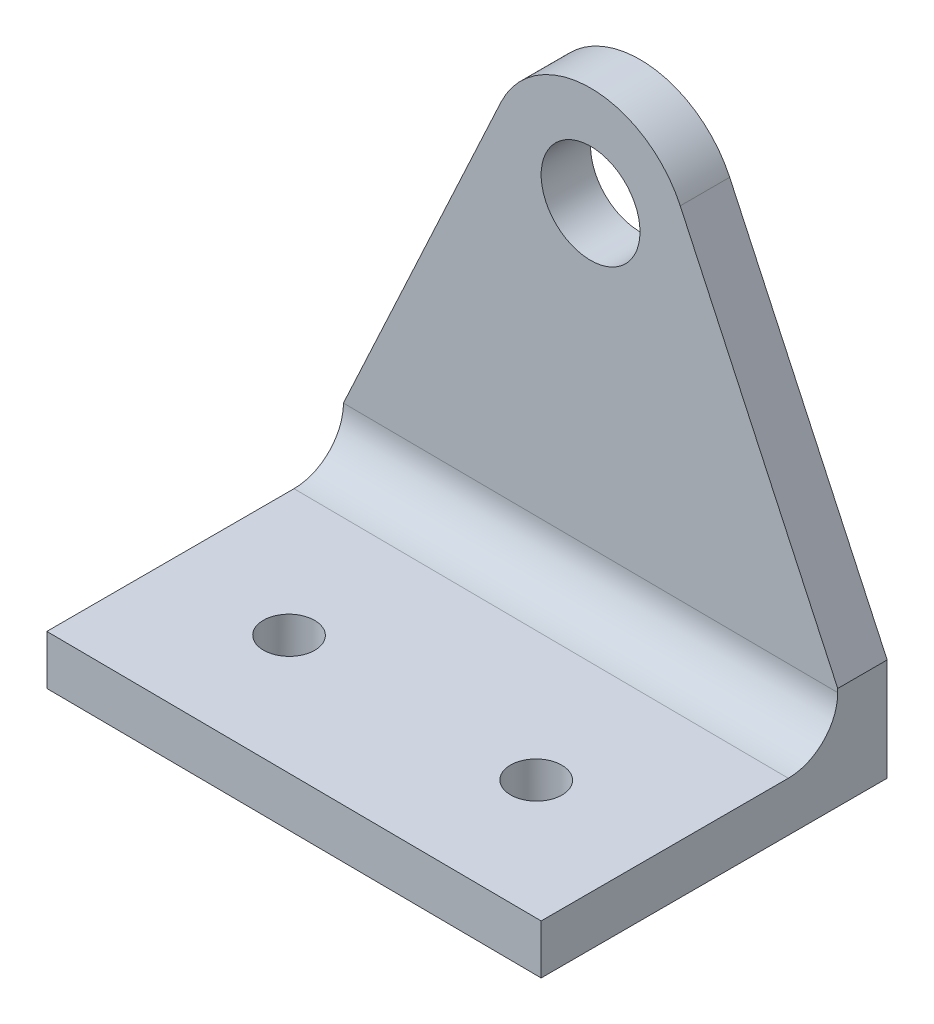
ISO-10303-21;
HEADER;
FILE_DESCRIPTION(('STEP AP214'),'2;1');
FILE_NAME('part.step','',(''),(''),'','','');
FILE_SCHEMA(('AUTOMOTIVE_DESIGN { 1 0 10303 214 1 1 1 1 }'));
ENDSEC;
DATA;
#1=APPLICATION_CONTEXT('core data for automotive mechanical design processes');
#2=APPLICATION_PROTOCOL_DEFINITION('international standard','automotive_design',2000,#1);
#3=PRODUCT_CONTEXT('',#1,'mechanical');
#4=PRODUCT('Part','Part','',(#3));
#5=PRODUCT_RELATED_PRODUCT_CATEGORY('part','',(#4));
#6=PRODUCT_DEFINITION_FORMATION('','',#4);
#7=PRODUCT_DEFINITION_CONTEXT('part definition',#1,'design');
#8=PRODUCT_DEFINITION('design','',#6,#7);
#9=PRODUCT_DEFINITION_SHAPE('','',#8);
#10=(LENGTH_UNIT() NAMED_UNIT(*) SI_UNIT(.MILLI.,.METRE.));
#11=(NAMED_UNIT(*) PLANE_ANGLE_UNIT() SI_UNIT($,.RADIAN.));
#12=(NAMED_UNIT(*) SI_UNIT($,.STERADIAN.) SOLID_ANGLE_UNIT());
#13=UNCERTAINTY_MEASURE_WITH_UNIT(LENGTH_MEASURE(1.E-05),#10,'distance_accuracy_value','');
#14=(GEOMETRIC_REPRESENTATION_CONTEXT(3) GLOBAL_UNCERTAINTY_ASSIGNED_CONTEXT((#13)) GLOBAL_UNIT_ASSIGNED_CONTEXT((#10,
#11,#12)) REPRESENTATION_CONTEXT('',''));
#15=CARTESIAN_POINT('',(0.,0.,0.));
#16=DIRECTION('',(0.,0.,1.));
#17=DIRECTION('',(1.,0.,0.));
#18=AXIS2_PLACEMENT_3D('',#15,#16,#17);
#19=CARTESIAN_POINT('',(0.,0.1022802611478,5.));
#20=DIRECTION('',(0.,0.,-1.));
#21=DIRECTION('',(-1.,0.,0.));
#22=AXIS2_PLACEMENT_3D('',#19,#20,#21);
#23=PLANE('',#22);
#24=DIRECTION('',(-0.421082862333626,-0.907022173405326,0.));
#25=VECTOR('',#24,1.);
#26=CARTESIAN_POINT('',(-9.07022173405326,4.31310888448406,5.));
#27=LINE('',#26,#25);
#28=CARTESIAN_POINT('',(-9.07022173405326,4.31310888448406,5.));
#29=VERTEX_POINT('',#28);
#30=CARTESIAN_POINT('',(-24.9999388374668,-29.9998682544963,5.));
#31=VERTEX_POINT('',#30);
#32=EDGE_CURVE('E148',#29,#31,#27,.T.);
#33=ORIENTED_EDGE('',*,*,#32,.T.);
#34=DIRECTION('',(0.999973562647782,-0.00727145140275181,0.));
#35=VECTOR('',#34,1.);
#36=CARTESIAN_POINT('',(-0.220202370179106,-30.1800576677222,5.));
#37=LINE('',#36,#35);
#38=CARTESIAN_POINT('',(25.,-30.363449992032,5.));
#39=VERTEX_POINT('',#38);
#40=EDGE_CURVE('E177',#31,#39,#37,.T.);
#41=ORIENTED_EDGE('',*,*,#40,.T.);
#42=DIRECTION('',(0.,1.,0.));
#43=VECTOR('',#42,1.);
#44=CARTESIAN_POINT('',(25.,-40.3635821822878,5.));
#45=LINE('',#44,#43);
#46=CARTESIAN_POINT('',(25.,-30.,5.));
#47=VERTEX_POINT('',#46);
#48=EDGE_CURVE('E152',#39,#47,#45,.T.);
#49=ORIENTED_EDGE('',*,*,#48,.T.);
#50=DIRECTION('',(-0.421082862333626,0.907022173405326,0.));
#51=VECTOR('',#50,1.);
#52=CARTESIAN_POINT('',(9.07022173405326,4.31310888448406,5.));
#53=LINE('',#52,#51);
#54=CARTESIAN_POINT('',(9.07022173405326,4.31310888448406,5.));
#55=VERTEX_POINT('',#54);
#56=EDGE_CURVE('E154',#47,#55,#53,.T.);
#57=ORIENTED_EDGE('',*,*,#56,.T.);
#58=CARTESIAN_POINT('',(0.,0.1022802611478,5.));
#59=DIRECTION('',(0.,0.,1.));
#60=DIRECTION('',(-1.,0.,0.));
#61=AXIS2_PLACEMENT_3D('',#58,#59,#60);
#62=CIRCLE('',#61,10.);
#63=EDGE_CURVE('E145',#55,#29,#62,.T.);
#64=ORIENTED_EDGE('',*,*,#63,.T.);
#65=EDGE_LOOP('',(#33,#41,#49,#57,#64));
#66=FACE_BOUND('',#65,.T.);
#67=CARTESIAN_POINT('',(0.,0.,5.));
#68=DIRECTION('',(0.,0.,1.));
#69=DIRECTION('',(1.,0.,0.));
#70=AXIS2_PLACEMENT_3D('',#67,#68,#69);
#71=CIRCLE('',#70,5.);
#72=CARTESIAN_POINT('',(5.,0.,5.));
#73=VERTEX_POINT('',#72);
#74=EDGE_CURVE('E139',#73,#73,#71,.T.);
#75=ORIENTED_EDGE('',*,*,#74,.F.);
#76=EDGE_LOOP('',(#75));
#77=FACE_BOUND('',#76,.T.);
#78=ADVANCED_FACE('F32',(#66,#77),#23,.F.);
#79=CARTESIAN_POINT('',(0.,0.1022802611478,0.));
#80=DIRECTION('',(0.,0.,-1.));
#81=DIRECTION('',(-1.,0.,0.));
#82=AXIS2_PLACEMENT_3D('',#79,#80,#81);
#83=PLANE('',#82);
#84=CARTESIAN_POINT('',(0.,0.1022802611478,0.));
#85=DIRECTION('',(0.,0.,1.));
#86=DIRECTION('',(-1.,0.,0.));
#87=AXIS2_PLACEMENT_3D('',#84,#85,#86);
#88=CIRCLE('',#87,10.);
#89=CARTESIAN_POINT('',(9.07022173405326,4.31310888448406,0.));
#90=VERTEX_POINT('',#89);
#91=CARTESIAN_POINT('',(-9.07022173405326,4.31310888448406,0.));
#92=VERTEX_POINT('',#91);
#93=EDGE_CURVE('E142',#90,#92,#88,.T.);
#94=ORIENTED_EDGE('',*,*,#93,.F.);
#95=DIRECTION('',(-0.421082862333626,0.907022173405326,0.));
#96=VECTOR('',#95,1.);
#97=CARTESIAN_POINT('',(9.07022173405326,4.31310888448406,0.));
#98=LINE('',#97,#96);
#99=CARTESIAN_POINT('',(25.,-30.,0.));
#100=VERTEX_POINT('',#99);
#101=EDGE_CURVE('E149',#100,#90,#98,.T.);
#102=ORIENTED_EDGE('',*,*,#101,.F.);
#103=DIRECTION('',(0.,1.,0.));
#104=VECTOR('',#103,1.);
#105=CARTESIAN_POINT('',(25.,-40.3635821822878,0.));
#106=LINE('',#105,#104);
#107=CARTESIAN_POINT('',(25.,-40.3635821822878,0.));
#108=VERTEX_POINT('',#107);
#109=EDGE_CURVE('E164',#108,#100,#106,.T.);
#110=ORIENTED_EDGE('',*,*,#109,.F.);
#111=DIRECTION('',(0.999973562647782,-0.00727145140275181,0.));
#112=VECTOR('',#111,1.);
#113=CARTESIAN_POINT('',(-25.,-40.,0.));
#114=LINE('',#113,#112);
#115=CARTESIAN_POINT('',(-25.,-40.,0.));
#116=VERTEX_POINT('',#115);
#117=EDGE_CURVE('E162',#116,#108,#114,.T.);
#118=ORIENTED_EDGE('',*,*,#117,.F.);
#119=DIRECTION('',(0.,-1.,0.));
#120=VECTOR('',#119,1.);
#121=CARTESIAN_POINT('',(-25.,-30.,0.));
#122=LINE('',#121,#120);
#123=CARTESIAN_POINT('',(-25.,-30.,0.));
#124=VERTEX_POINT('',#123);
#125=EDGE_CURVE('E108',#124,#116,#122,.T.);
#126=ORIENTED_EDGE('',*,*,#125,.F.);
#127=DIRECTION('',(-0.421082862333626,-0.907022173405326,0.));
#128=VECTOR('',#127,1.);
#129=CARTESIAN_POINT('',(-9.07022173405326,4.31310888448406,0.));
#130=LINE('',#129,#128);
#131=EDGE_CURVE('E159',#92,#124,#130,.T.);
#132=ORIENTED_EDGE('',*,*,#131,.F.);
#133=EDGE_LOOP('',(#94,#102,#110,#118,#126,#132));
#134=FACE_BOUND('',#133,.T.);
#135=CARTESIAN_POINT('',(0.,0.,0.));
#136=DIRECTION('',(0.,0.,1.));
#137=DIRECTION('',(1.,0.,0.));
#138=AXIS2_PLACEMENT_3D('',#135,#136,#137);
#139=CIRCLE('',#138,5.);
#140=CARTESIAN_POINT('',(5.,0.,0.));
#141=VERTEX_POINT('',#140);
#142=EDGE_CURVE('E138',#141,#141,#139,.T.);
#143=ORIENTED_EDGE('',*,*,#142,.T.);
#144=EDGE_LOOP('',(#143));
#145=FACE_BOUND('',#144,.T.);
#146=ADVANCED_FACE('F208',(#134,#145),#83,.T.);
#147=CARTESIAN_POINT('',(0.,0.1022802611478,5.));
#148=DIRECTION('',(0.,0.,-1.));
#149=DIRECTION('',(-1.,0.,0.));
#150=AXIS2_PLACEMENT_3D('',#147,#148,#149);
#151=CYLINDRICAL_SURFACE('',#150,10.);
#152=ORIENTED_EDGE('',*,*,#93,.T.);
#153=DIRECTION('',(0.,0.,-1.));
#154=VECTOR('',#153,1.);
#155=CARTESIAN_POINT('',(-9.07022173405326,4.31310888448406,5.));
#156=LINE('',#155,#154);
#157=EDGE_CURVE('E174',#29,#92,#156,.T.);
#158=ORIENTED_EDGE('',*,*,#157,.F.);
#159=ORIENTED_EDGE('',*,*,#63,.F.);
#160=DIRECTION('',(0.,0.,-1.));
#161=VECTOR('',#160,1.);
#162=CARTESIAN_POINT('',(9.07022173405326,4.31310888448406,5.));
#163=LINE('',#162,#161);
#164=EDGE_CURVE('E156',#55,#90,#163,.T.);
#165=ORIENTED_EDGE('',*,*,#164,.T.);
#166=EDGE_LOOP('',(#152,#158,#159,#165));
#167=FACE_BOUND('',#166,.T.);
#168=ADVANCED_FACE('F205',(#167),#151,.T.);
#169=CARTESIAN_POINT('',(-9.07022173405326,4.31310888448406,5.));
#170=DIRECTION('',(0.907022173405326,-0.421082862333626,0.));
#171=DIRECTION('',(0.421082862333626,0.907022173405326,0.));
#172=AXIS2_PLACEMENT_3D('',#169,#170,#171);
#173=PLANE('',#172);
#174=ORIENTED_EDGE('',*,*,#131,.T.);
#175=DIRECTION('',(0.,0.,-1.));
#176=VECTOR('',#175,1.);
#177=CARTESIAN_POINT('',(-25.,-30.,5.));
#178=LINE('',#177,#176);
#179=CARTESIAN_POINT('',(-25.,-30.,5.00000000174733));
#180=VERTEX_POINT('',#179);
#181=EDGE_CURVE('E111',#180,#124,#178,.T.);
#182=ORIENTED_EDGE('',*,*,#181,.F.);
#183=CARTESIAN_POINT('',(-24.9999388374668,-29.9998682544963,10.));
#184=DIRECTION('',(0.907022173405326,-0.421082862333626,0.));
#185=DIRECTION('',(0.421082862333626,0.907022173405326,0.));
#186=AXIS2_PLACEMENT_3D('',#183,#184,#185);
#187=ELLIPSE('',#186,5.49414277415402,5.);
#188=EDGE_CURVE('E11',#180,#31,#187,.T.);
#189=ORIENTED_EDGE('',*,*,#188,.T.);
#190=ORIENTED_EDGE('',*,*,#32,.F.);
#191=ORIENTED_EDGE('',*,*,#157,.T.);
#192=EDGE_LOOP('',(#174,#182,#189,#190,#191));
#193=FACE_BOUND('',#192,.T.);
#194=ADVANCED_FACE('F190',(#193),#173,.F.);
#195=CARTESIAN_POINT('',(-25.,-30.,5.));
#196=DIRECTION('',(1.,0.,0.));
#197=DIRECTION('',(0.,1.,0.));
#198=AXIS2_PLACEMENT_3D('',#195,#196,#197);
#199=PLANE('',#198);
#200=ORIENTED_EDGE('',*,*,#125,.T.);
#201=DIRECTION('',(0.,0.,-1.));
#202=VECTOR('',#201,1.);
#203=CARTESIAN_POINT('',(-25.,-40.,5.));
#204=LINE('',#203,#202);
#205=CARTESIAN_POINT('',(-25.,-40.,35.));
#206=VERTEX_POINT('',#205);
#207=EDGE_CURVE('E99',#206,#116,#204,.T.);
#208=ORIENTED_EDGE('',*,*,#207,.F.);
#209=DIRECTION('',(0.,-1.,0.));
#210=VECTOR('',#209,1.);
#211=CARTESIAN_POINT('',(-25.,-35.,35.));
#212=LINE('',#211,#210);
#213=CARTESIAN_POINT('',(-25.,-35.,35.));
#214=VERTEX_POINT('',#213);
#215=EDGE_CURVE('E104',#214,#206,#212,.T.);
#216=ORIENTED_EDGE('',*,*,#215,.F.);
#217=DIRECTION('',(0.,0.,-1.));
#218=VECTOR('',#217,1.);
#219=CARTESIAN_POINT('',(-25.,-35.,35.));
#220=LINE('',#219,#218);
#221=CARTESIAN_POINT('',(-25.,-35.,10.));
#222=VERTEX_POINT('',#221);
#223=EDGE_CURVE('E134',#214,#222,#220,.T.);
#224=ORIENTED_EDGE('',*,*,#223,.T.);
#225=CARTESIAN_POINT('',(-25.,-29.9998678097442,10.));
#226=DIRECTION('',(1.,0.,0.));
#227=DIRECTION('',(0.,-1.,0.));
#228=AXIS2_PLACEMENT_3D('',#225,#226,#227);
#229=ELLIPSE('',#228,5.00013219025585,5.);
#230=EDGE_CURVE('E42',#222,#180,#229,.T.);
#231=ORIENTED_EDGE('',*,*,#230,.T.);
#232=ORIENTED_EDGE('',*,*,#181,.T.);
#233=EDGE_LOOP('',(#200,#208,#216,#224,#231,#232));
#234=FACE_BOUND('',#233,.T.);
#235=ADVANCED_FACE('F101',(#234),#199,.F.);
#236=CARTESIAN_POINT('',(-25.,-40.,5.));
#237=DIRECTION('',(0.00727145140275181,0.999973562647782,0.));
#238=DIRECTION('',(-0.999973562647782,0.00727145140275181,0.));
#239=AXIS2_PLACEMENT_3D('',#236,#237,#238);
#240=PLANE('',#239);
#241=CARTESIAN_POINT('',(12.5380126326247,-40.2729630510343,23.));
#242=DIRECTION('',(0.00727145140275181,0.999973562647782,0.));
#243=DIRECTION('',(-0.999973562647782,0.00727145140275181,0.));
#244=AXIS2_PLACEMENT_3D('',#241,#242,#243);
#245=ELLIPSE('',#244,2.60027497390656,2.6);
#246=CARTESIAN_POINT('',(9.93780640310352,-40.2540552779278,23.));
#247=VERTEX_POINT('',#246);
#248=EDGE_CURVE('E346',#247,#247,#245,.F.);
#249=ORIENTED_EDGE('',*,*,#248,.F.);
#250=EDGE_LOOP('',(#249));
#251=FACE_BOUND('',#250,.T.);
#252=CARTESIAN_POINT('',(-12.5366867627269,-40.0906287725069,23.));
#253=DIRECTION('',(0.00727145140275181,0.999973562647782,0.));
#254=DIRECTION('',(-0.999973562647782,0.00727145140275181,0.));
#255=AXIS2_PLACEMENT_3D('',#252,#253,#254);
#256=CIRCLE('',#255,2.6);
#257=CARTESIAN_POINT('',(-15.1366180256111,-40.0717229988597,23.));
#258=VERTEX_POINT('',#257);
#259=EDGE_CURVE('E125',#258,#258,#256,.T.);
#260=ORIENTED_EDGE('',*,*,#259,.T.);
#261=EDGE_LOOP('',(#260));
#262=FACE_BOUND('',#261,.T.);
#263=ORIENTED_EDGE('',*,*,#117,.T.);
#264=DIRECTION('',(0.,0.,-1.));
#265=VECTOR('',#264,1.);
#266=CARTESIAN_POINT('',(25.,-40.3635821822878,5.));
#267=LINE('',#266,#265);
#268=CARTESIAN_POINT('',(25.,-40.3635821822878,35.));
#269=VERTEX_POINT('',#268);
#270=EDGE_CURVE('E112',#269,#108,#267,.T.);
#271=ORIENTED_EDGE('',*,*,#270,.F.);
#272=DIRECTION('',(0.999973562647782,-0.00727145140275181,0.));
#273=VECTOR('',#272,1.);
#274=CARTESIAN_POINT('',(-25.,-40.,35.));
#275=LINE('',#274,#273);
#276=EDGE_CURVE('E115',#206,#269,#275,.T.);
#277=ORIENTED_EDGE('',*,*,#276,.F.);
#278=ORIENTED_EDGE('',*,*,#207,.T.);
#279=EDGE_LOOP('',(#263,#271,#277,#278));
#280=FACE_BOUND('',#279,.T.);
#281=ADVANCED_FACE('F116',(#251,#262,#280),#240,.F.);
#282=CARTESIAN_POINT('',(25.,-40.3635821822878,5.));
#283=DIRECTION('',(-1.,0.,0.));
#284=DIRECTION('',(0.,0.,1.));
#285=AXIS2_PLACEMENT_3D('',#282,#283,#284);
#286=PLANE('',#285);
#287=ORIENTED_EDGE('',*,*,#109,.T.);
#288=DIRECTION('',(0.,0.,-1.));
#289=VECTOR('',#288,1.);
#290=CARTESIAN_POINT('',(25.,-30.,5.));
#291=LINE('',#290,#289);
#292=EDGE_CURVE('E169',#47,#100,#291,.T.);
#293=ORIENTED_EDGE('',*,*,#292,.F.);
#294=ORIENTED_EDGE('',*,*,#48,.F.);
#295=CARTESIAN_POINT('',(25.,-30.363449992032,10.));
#296=DIRECTION('',(-1.,0.,0.));
#297=DIRECTION('',(0.,-1.,0.));
#298=AXIS2_PLACEMENT_3D('',#295,#296,#297);
#299=ELLIPSE('',#298,5.00013219025585,5.);
#300=CARTESIAN_POINT('',(25.,-35.3635821822878,10.));
#301=VERTEX_POINT('',#300);
#302=EDGE_CURVE('E49',#39,#301,#299,.T.);
#303=ORIENTED_EDGE('',*,*,#302,.T.);
#304=DIRECTION('',(0.,0.,-1.));
#305=VECTOR('',#304,1.);
#306=CARTESIAN_POINT('',(25.,-35.3635821822878,35.));
#307=LINE('',#306,#305);
#308=CARTESIAN_POINT('',(25.,-35.3635821822878,35.));
#309=VERTEX_POINT('',#308);
#310=EDGE_CURVE('E136',#309,#301,#307,.T.);
#311=ORIENTED_EDGE('',*,*,#310,.F.);
#312=DIRECTION('',(0.,1.,0.));
#313=VECTOR('',#312,1.);
#314=CARTESIAN_POINT('',(25.,-40.3635821822878,35.));
#315=LINE('',#314,#313);
#316=EDGE_CURVE('E120',#269,#309,#315,.T.);
#317=ORIENTED_EDGE('',*,*,#316,.F.);
#318=ORIENTED_EDGE('',*,*,#270,.T.);
#319=EDGE_LOOP('',(#287,#293,#294,#303,#311,#317,#318));
#320=FACE_BOUND('',#319,.T.);
#321=ADVANCED_FACE('F195',(#320),#286,.F.);
#322=CARTESIAN_POINT('',(9.07022173405326,4.31310888448406,5.));
#323=DIRECTION('',(-0.907022173405326,-0.421082862333626,0.));
#324=DIRECTION('',(0.421082862333626,-0.907022173405326,0.));
#325=AXIS2_PLACEMENT_3D('',#322,#323,#324);
#326=PLANE('',#325);
#327=ORIENTED_EDGE('',*,*,#101,.T.);
#328=ORIENTED_EDGE('',*,*,#164,.F.);
#329=ORIENTED_EDGE('',*,*,#56,.F.);
#330=ORIENTED_EDGE('',*,*,#292,.T.);
#331=EDGE_LOOP('',(#327,#328,#329,#330));
#332=FACE_BOUND('',#331,.T.);
#333=ADVANCED_FACE('F201',(#332),#326,.F.);
#334=CARTESIAN_POINT('',(0.,0.,5.));
#335=DIRECTION('',(0.,0.,-1.));
#336=DIRECTION('',(-1.,0.,0.));
#337=AXIS2_PLACEMENT_3D('',#334,#335,#336);
#338=CYLINDRICAL_SURFACE('',#337,5.);
#339=ORIENTED_EDGE('',*,*,#74,.T.);
#340=EDGE_LOOP('',(#339));
#341=FACE_BOUND('',#340,.T.);
#342=ORIENTED_EDGE('',*,*,#142,.F.);
#343=EDGE_LOOP('',(#342));
#344=FACE_BOUND('',#343,.T.);
#345=ADVANCED_FACE('F213',(#341,#344),#338,.F.);
#346=CARTESIAN_POINT('',(-25.,-35.,35.));
#347=DIRECTION('',(0.00727145140275181,0.999973562647782,0.));
#348=DIRECTION('',(-0.999973562647782,0.00727145140275181,0.));
#349=AXIS2_PLACEMENT_3D('',#346,#347,#348);
#350=PLANE('',#349);
#351=CARTESIAN_POINT('',(12.501652491788,-35.2726986530473,23.));
#352=DIRECTION('',(0.00727145140275181,0.999973562647782,0.));
#353=DIRECTION('',(-0.999973562647782,0.00727145140275181,0.));
#354=AXIS2_PLACEMENT_3D('',#351,#352,#353);
#355=ELLIPSE('',#354,2.60027497390656,2.6);
#356=CARTESIAN_POINT('',(9.9014462622668,-35.2537908799407,23.));
#357=VERTEX_POINT('',#356);
#358=EDGE_CURVE('E36',#357,#357,#355,.F.);
#359=ORIENTED_EDGE('',*,*,#358,.T.);
#360=EDGE_LOOP('',(#359));
#361=FACE_BOUND('',#360,.T.);
#362=CARTESIAN_POINT('',(-12.5003304669027,-35.0908931425344,23.));
#363=DIRECTION('',(0.00727145140275182,0.999973562647782,0.));
#364=DIRECTION('',(-0.999973562647782,0.00727145140275182,0.));
#365=AXIS2_PLACEMENT_3D('',#362,#363,#364);
#366=CIRCLE('',#365,2.6);
#367=CARTESIAN_POINT('',(-15.100261729787,-35.0719873688873,23.));
#368=VERTEX_POINT('',#367);
#369=EDGE_CURVE('E128',#368,#368,#366,.T.);
#370=ORIENTED_EDGE('',*,*,#369,.F.);
#371=EDGE_LOOP('',(#370));
#372=FACE_BOUND('',#371,.T.);
#373=ORIENTED_EDGE('',*,*,#310,.T.);
#374=DIRECTION('',(0.999973562647782,-0.00727145140275181,0.));
#375=VECTOR('',#374,1.);
#376=CARTESIAN_POINT('',(-25.,-35.,10.));
#377=LINE('',#376,#375);
#378=EDGE_CURVE('E180',#301,#222,#377,.F.);
#379=ORIENTED_EDGE('',*,*,#378,.T.);
#380=ORIENTED_EDGE('',*,*,#223,.F.);
#381=DIRECTION('',(0.999973562647782,-0.00727145140275181,0.));
#382=VECTOR('',#381,1.);
#383=CARTESIAN_POINT('',(-25.,-35.,35.));
#384=LINE('',#383,#382);
#385=EDGE_CURVE('E124',#214,#309,#384,.T.);
#386=ORIENTED_EDGE('',*,*,#385,.T.);
#387=EDGE_LOOP('',(#373,#379,#380,#386));
#388=FACE_BOUND('',#387,.T.);
#389=ADVANCED_FACE('F211',(#361,#372,#388),#350,.T.);
#390=CARTESIAN_POINT('',(0.,0.,35.));
#391=DIRECTION('',(0.,0.,1.));
#392=DIRECTION('',(1.,0.,0.));
#393=AXIS2_PLACEMENT_3D('',#390,#391,#392);
#394=PLANE('',#393);
#395=ORIENTED_EDGE('',*,*,#215,.T.);
#396=ORIENTED_EDGE('',*,*,#276,.T.);
#397=ORIENTED_EDGE('',*,*,#316,.T.);
#398=ORIENTED_EDGE('',*,*,#385,.F.);
#399=EDGE_LOOP('',(#395,#396,#397,#398));
#400=FACE_BOUND('',#399,.T.);
#401=ADVANCED_FACE('F122',(#400),#394,.T.);
#402=CARTESIAN_POINT('',(-0.220202370179106,-30.1800576677222,10.));
#403=DIRECTION('',(0.999973562647782,-0.00727145140275181,0.));
#404=DIRECTION('',(0.00727145140275181,0.999973562647782,0.));
#405=AXIS2_PLACEMENT_3D('',#402,#403,#404);
#406=CYLINDRICAL_SURFACE('',#405,5.);
#407=ORIENTED_EDGE('',*,*,#230,.F.);
#408=ORIENTED_EDGE('',*,*,#378,.F.);
#409=ORIENTED_EDGE('',*,*,#302,.F.);
#410=ORIENTED_EDGE('',*,*,#40,.F.);
#411=ORIENTED_EDGE('',*,*,#188,.F.);
#412=EDGE_LOOP('',(#407,#408,#409,#410,#411));
#413=FACE_BOUND('',#412,.T.);
#414=ADVANCED_FACE('F34',(#413),#406,.F.);
#415=CARTESIAN_POINT('',(-12.7184740089853,-65.0901000219679,23.));
#416=DIRECTION('',(0.00727145140275181,0.999973562647782,0.));
#417=DIRECTION('',(-0.999973562647782,0.00727145140275181,0.));
#418=AXIS2_PLACEMENT_3D('',#415,#416,#417);
#419=CYLINDRICAL_SURFACE('',#418,2.6);
#420=ORIENTED_EDGE('',*,*,#369,.T.);
#421=EDGE_LOOP('',(#420));
#422=FACE_BOUND('',#421,.T.);
#423=ORIENTED_EDGE('',*,*,#259,.F.);
#424=EDGE_LOOP('',(#423));
#425=FACE_BOUND('',#424,.T.);
#426=ADVANCED_FACE('F323',(#422,#425),#419,.F.);
#427=CARTESIAN_POINT('',(12.7184740089853,-65.0901000219679,23.));
#428=DIRECTION('',(-0.00727145140275181,0.999973562647782,0.));
#429=DIRECTION('',(-0.999973562647782,-0.00727145140275181,0.));
#430=AXIS2_PLACEMENT_3D('',#427,#428,#429);
#431=CYLINDRICAL_SURFACE('',#430,2.6);
#432=ORIENTED_EDGE('',*,*,#358,.F.);
#433=EDGE_LOOP('',(#432));
#434=FACE_BOUND('',#433,.T.);
#435=ORIENTED_EDGE('',*,*,#248,.T.);
#436=EDGE_LOOP('',(#435));
#437=FACE_BOUND('',#436,.T.);
#438=ADVANCED_FACE('F319',(#434,#437),#431,.F.);
#439=CLOSED_SHELL('',(#78,#146,#168,#194,#235,#281,#321,#333,#345,#389,#401,#414,#426,#438));
#440=MANIFOLD_SOLID_BREP('B2',#439);
#441=ADVANCED_BREP_SHAPE_REPRESENTATION('',(#18,#440),#14);
#442=SHAPE_DEFINITION_REPRESENTATION(#9,#441);
ENDSEC;
END-ISO-10303-21;
